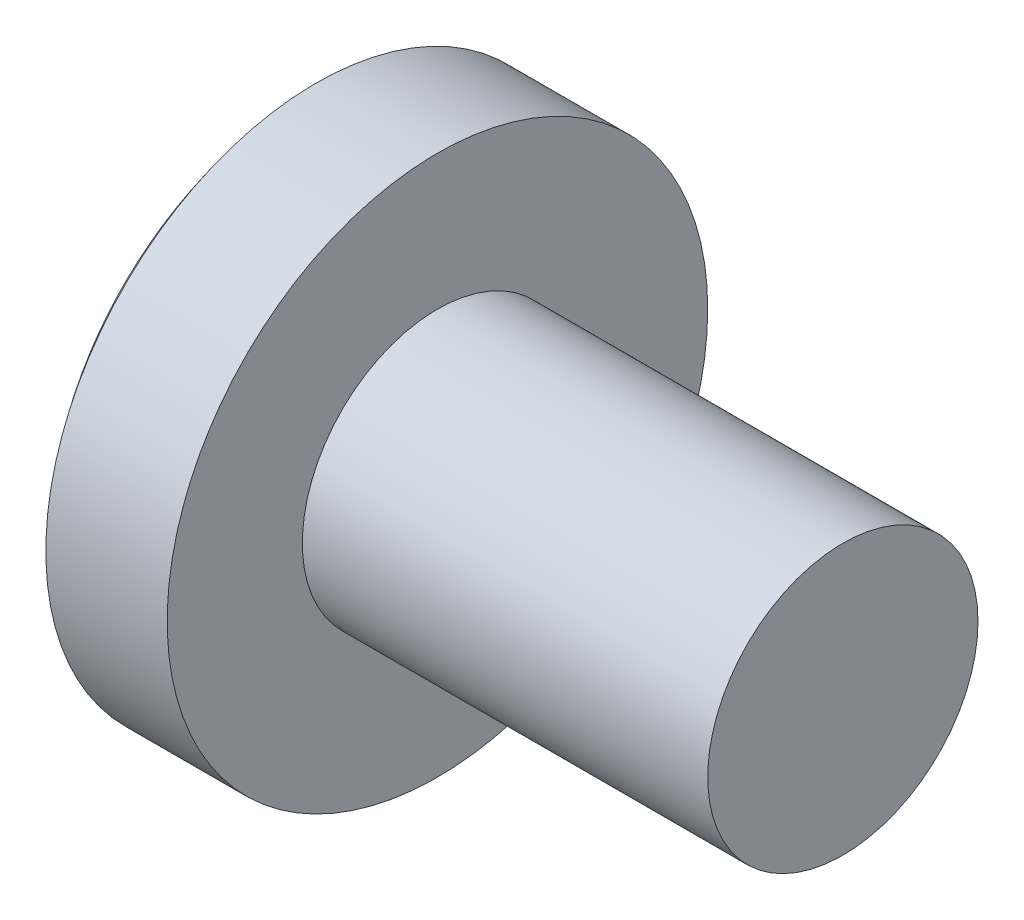
ISO-10303-21;
HEADER;
FILE_DESCRIPTION(('STEP AP214'),'2;1');
FILE_NAME('part.step','',(''),(''),'','','');
FILE_SCHEMA(('AUTOMOTIVE_DESIGN { 1 0 10303 214 1 1 1 1 }'));
ENDSEC;
DATA;
#1=APPLICATION_CONTEXT('core data for automotive mechanical design processes');
#2=APPLICATION_PROTOCOL_DEFINITION('international standard','automotive_design',2000,#1);
#3=PRODUCT_CONTEXT('',#1,'mechanical');
#4=PRODUCT('Part','Part','',(#3));
#5=PRODUCT_RELATED_PRODUCT_CATEGORY('part','',(#4));
#6=PRODUCT_DEFINITION_FORMATION('','',#4);
#7=PRODUCT_DEFINITION_CONTEXT('part definition',#1,'design');
#8=PRODUCT_DEFINITION('design','',#6,#7);
#9=PRODUCT_DEFINITION_SHAPE('','',#8);
#10=(LENGTH_UNIT() NAMED_UNIT(*) SI_UNIT(.MILLI.,.METRE.));
#11=(NAMED_UNIT(*) PLANE_ANGLE_UNIT() SI_UNIT($,.RADIAN.));
#12=(NAMED_UNIT(*) SI_UNIT($,.STERADIAN.) SOLID_ANGLE_UNIT());
#13=UNCERTAINTY_MEASURE_WITH_UNIT(LENGTH_MEASURE(1.E-05),#10,'distance_accuracy_value','');
#14=(GEOMETRIC_REPRESENTATION_CONTEXT(3) GLOBAL_UNCERTAINTY_ASSIGNED_CONTEXT((#13)) GLOBAL_UNIT_ASSIGNED_CONTEXT((#10,
#11,#12)) REPRESENTATION_CONTEXT('',''));
#15=CARTESIAN_POINT('',(0.,0.,0.));
#16=DIRECTION('',(0.,0.,1.));
#17=DIRECTION('',(1.,0.,0.));
#18=AXIS2_PLACEMENT_3D('',#15,#16,#17);
#19=CARTESIAN_POINT('',(3.2,0.,0.));
#20=DIRECTION('',(1.,0.,0.));
#21=DIRECTION('',(0.,1.,0.));
#22=AXIS2_PLACEMENT_3D('',#19,#20,#21);
#23=SPHERICAL_SURFACE('',#22,3.2);
#24=CARTESIAN_POINT('',(0.70200080064064,0.,0.));
#25=DIRECTION('',(1.,0.,0.));
#26=DIRECTION('',(0.,0.,-1.));
#27=AXIS2_PLACEMENT_3D('',#24,#25,#26);
#28=CIRCLE('',#27,2.);
#29=CARTESIAN_POINT('',(0.70200080064064,0.,-2.));
#30=VERTEX_POINT('',#29);
#31=EDGE_CURVE('E227',#30,#30,#28,.T.);
#32=ORIENTED_EDGE('',*,*,#31,.F.);
#33=EDGE_LOOP('',(#32));
#34=FACE_BOUND('',#33,.T.);
#35=CARTESIAN_POINT('',(3.2,-0.19,0.));
#36=DIRECTION('',(0.,1.,0.));
#37=DIRECTION('',(0.,0.,1.));
#38=AXIS2_PLACEMENT_3D('',#35,#36,#37);
#39=CIRCLE('',#38,3.19435439486604);
#40=CARTESIAN_POINT('',(0.128116518841081,-0.19,0.876031893359463));
#41=VERTEX_POINT('',#40);
#42=CARTESIAN_POINT('',(0.0434512517624563,-0.19,0.49));
#43=VERTEX_POINT('',#42);
#44=EDGE_CURVE('E161',#41,#43,#39,.F.);
#45=ORIENTED_EDGE('',*,*,#44,.T.);
#46=CARTESIAN_POINT('',(0.0434512517624563,-0.19,0.49));
#47=CARTESIAN_POINT('',(0.0408738773929441,-0.189985118490982,0.473411368352518));
#48=CARTESIAN_POINT('',(0.0385122737731478,-0.191375280547119,0.45678774580514));
#49=CARTESIAN_POINT('',(0.0342793774917008,-0.196894192604607,0.423939980878307));
#50=CARTESIAN_POINT('',(0.0324080180986077,-0.201022569613025,0.407715784402144));
#51=CARTESIAN_POINT('',(0.0292120609216635,-0.2119518671846,0.376115889679846));
#52=CARTESIAN_POINT('',(0.0278880075495777,-0.218755435732716,0.360741049401918));
#53=CARTESIAN_POINT('',(0.0258300216333501,-0.234850871954501,0.331318538531042));
#54=CARTESIAN_POINT('',(0.0250958387239777,-0.244141681706182,0.317270307107504));
#55=CARTESIAN_POINT('',(0.0242453397312418,-0.264820786877322,0.291079740811089));
#56=CARTESIAN_POINT('',(0.0241213644300016,-0.276181215319776,0.27891564613864));
#57=CARTESIAN_POINT('',(0.0244743849819796,-0.300751739444163,0.256633055026912));
#58=CARTESIAN_POINT('',(0.0249514532038772,-0.313962057691943,0.246514805087926));
#59=CARTESIAN_POINT('',(0.0264873092406797,-0.341764748147378,0.22866155902565));
#60=CARTESIAN_POINT('',(0.0275427361860059,-0.35634873623303,0.220913192921297));
#61=CARTESIAN_POINT('',(0.0302016331156969,-0.386546091629584,0.207923367225205));
#62=CARTESIAN_POINT('',(0.0318049788587366,-0.402159224933208,0.20268133996367));
#63=CARTESIAN_POINT('',(0.0350324297399574,-0.429857047162115,0.195839033890913));
#64=CARTESIAN_POINT('',(0.0365444859821157,-0.441812973684979,0.193648149789925));
#65=CARTESIAN_POINT('',(0.039817225939547,-0.465850838778572,0.190728248289838));
#66=CARTESIAN_POINT('',(0.0415775491224675,-0.47793257149748,0.189997133951023));
#67=CARTESIAN_POINT('',(0.0434512517624562,-0.49,0.19));
#68=B_SPLINE_CURVE_WITH_KNOTS('',3,(#46,#47,#48,#49,#50,#51,#52,#53,#54,#55,#56,#57,#58,#59,#60,
#61,#62,#63,#64,#65,#66,#67),.UNSPECIFIED.,.F.,.F.,(4,2,2,2,2,2,2,2,2,2,4),(0.,
0.0503064187517195,0.100605986293286,0.150955467701084,0.20128356741648,0.250978317771727,
0.300679052198083,0.350093989724498,0.39949772977393,0.43615717693199,0.472763925288841),.UNSPECIFIED.);
#69=CARTESIAN_POINT('',(0.0434512517624563,-0.49,0.19));
#70=VERTEX_POINT('',#69);
#71=EDGE_CURVE('E146',#43,#70,#68,.T.);
#72=ORIENTED_EDGE('',*,*,#71,.T.);
#73=CARTESIAN_POINT('',(3.2,0.,0.19));
#74=DIRECTION('',(0.,0.,-1.));
#75=DIRECTION('',(0.,1.,0.));
#76=AXIS2_PLACEMENT_3D('',#73,#74,#75);
#77=CIRCLE('',#76,3.19435439486604);
#78=CARTESIAN_POINT('',(0.128116518841081,-0.876031893359464,0.19));
#79=VERTEX_POINT('',#78);
#80=EDGE_CURVE('E170',#70,#79,#77,.F.);
#81=ORIENTED_EDGE('',*,*,#80,.T.);
#82=CARTESIAN_POINT('',(2.81136206679761,0.673140646055105,0.));
#83=DIRECTION('',(-0.500000000000001,0.866025403784438,0.));
#84=DIRECTION('',(-0.866025403784438,-0.500000000000001,0.));
#85=AXIS2_PLACEMENT_3D('',#82,#83,#84);
#86=CIRCLE('',#85,3.10416530286399);
#87=CARTESIAN_POINT('',(0.128116518841081,-0.876031893359464,-0.19));
#88=VERTEX_POINT('',#87);
#89=EDGE_CURVE('E173',#79,#88,#86,.F.);
#90=ORIENTED_EDGE('',*,*,#89,.T.);
#91=CARTESIAN_POINT('',(3.2,0.,-0.19));
#92=DIRECTION('',(0.,0.,1.));
#93=DIRECTION('',(1.,0.,0.));
#94=AXIS2_PLACEMENT_3D('',#91,#92,#93);
#95=CIRCLE('',#94,3.19435439486604);
#96=CARTESIAN_POINT('',(0.0434512517624563,-0.49,-0.19));
#97=VERTEX_POINT('',#96);
#98=EDGE_CURVE('E180',#88,#97,#95,.F.);
#99=ORIENTED_EDGE('',*,*,#98,.T.);
#100=CARTESIAN_POINT('',(0.0434512517624563,-0.49,-0.19));
#101=CARTESIAN_POINT('',(0.0408738773929441,-0.473411368352518,-0.189985118490982));
#102=CARTESIAN_POINT('',(0.0385122737731478,-0.45678774580514,-0.191375280547119));
#103=CARTESIAN_POINT('',(0.0342793774917008,-0.423939980878307,-0.196894192604607));
#104=CARTESIAN_POINT('',(0.0324080180986077,-0.407715784402144,-0.201022569613025));
#105=CARTESIAN_POINT('',(0.0292120609216635,-0.376115889679846,-0.2119518671846));
#106=CARTESIAN_POINT('',(0.0278880075495777,-0.360741049401919,-0.218755435732716));
#107=CARTESIAN_POINT('',(0.0258300216333501,-0.331318538531043,-0.234850871954501));
#108=CARTESIAN_POINT('',(0.0250958387239777,-0.317270307107504,-0.244141681706183));
#109=CARTESIAN_POINT('',(0.0242453397312419,-0.291079740811089,-0.264820786877322));
#110=CARTESIAN_POINT('',(0.0241213644300017,-0.278915646138641,-0.276181215319776));
#111=CARTESIAN_POINT('',(0.0244743849819797,-0.256633055026913,-0.300751739444163));
#112=CARTESIAN_POINT('',(0.0249514532038773,-0.246514805087927,-0.313962057691943));
#113=CARTESIAN_POINT('',(0.0264873092406797,-0.22866155902565,-0.341764748147378));
#114=CARTESIAN_POINT('',(0.0275427361860059,-0.220913192921297,-0.356348736233031));
#115=CARTESIAN_POINT('',(0.0302016331156969,-0.207923367225206,-0.386546091629584));
#116=CARTESIAN_POINT('',(0.0318049788587366,-0.20268133996367,-0.402159224933208));
#117=CARTESIAN_POINT('',(0.0350324297399575,-0.195839033890914,-0.429857047162115));
#118=CARTESIAN_POINT('',(0.0365444859821158,-0.193648149789925,-0.441812973684979));
#119=CARTESIAN_POINT('',(0.0398172259395471,-0.190728248289838,-0.465850838778572));
#120=CARTESIAN_POINT('',(0.0415775491224675,-0.189997133951024,-0.47793257149748));
#121=CARTESIAN_POINT('',(0.0434512517624562,-0.19,-0.49));
#122=B_SPLINE_CURVE_WITH_KNOTS('',3,(#100,#101,#102,#103,#104,#105,#106,#107,#108,#109,#110,
#111,#112,#113,#114,#115,#116,#117,#118,#119,#120,#121),.UNSPECIFIED.,.F.,.F.,(4,2,2,2,2,2,2,2,
2,2,4),(0.,0.0503064187517195,0.100605986293286,0.150955467701084,0.20128356741648,
0.250978317771727,0.300679052198083,0.350093989724498,0.39949772977393,0.43615717693199,
0.472763925288841),.UNSPECIFIED.);
#123=CARTESIAN_POINT('',(0.0434512517624563,-0.19,-0.49));
#124=VERTEX_POINT('',#123);
#125=EDGE_CURVE('E157',#97,#124,#122,.T.);
#126=ORIENTED_EDGE('',*,*,#125,.T.);
#127=CARTESIAN_POINT('',(3.2,-0.19,0.));
#128=DIRECTION('',(0.,1.,0.));
#129=DIRECTION('',(0.,0.,1.));
#130=AXIS2_PLACEMENT_3D('',#127,#128,#129);
#131=CIRCLE('',#130,3.19435439486604);
#132=CARTESIAN_POINT('',(0.128116518841082,-0.19,-0.876031893359464));
#133=VERTEX_POINT('',#132);
#134=EDGE_CURVE('E178',#124,#133,#131,.F.);
#135=ORIENTED_EDGE('',*,*,#134,.T.);
#136=CARTESIAN_POINT('',(2.81136206679761,0.,0.673140646055104));
#137=DIRECTION('',(-0.500000000000001,0.,0.866025403784438));
#138=DIRECTION('',(0.866025403784438,0.,0.500000000000001));
#139=AXIS2_PLACEMENT_3D('',#136,#137,#138);
#140=CIRCLE('',#139,3.10416530286399);
#141=CARTESIAN_POINT('',(0.128116518841082,0.19,-0.876031893359464));
#142=VERTEX_POINT('',#141);
#143=EDGE_CURVE('E181',#133,#142,#140,.F.);
#144=ORIENTED_EDGE('',*,*,#143,.T.);
#145=CARTESIAN_POINT('',(3.2,0.19,0.));
#146=DIRECTION('',(0.,-1.,0.));
#147=DIRECTION('',(0.,0.,-1.));
#148=AXIS2_PLACEMENT_3D('',#145,#146,#147);
#149=CIRCLE('',#148,3.19435439486604);
#150=CARTESIAN_POINT('',(0.0434512517624563,0.19,-0.49));
#151=VERTEX_POINT('',#150);
#152=EDGE_CURVE('E182',#142,#151,#149,.F.);
#153=ORIENTED_EDGE('',*,*,#152,.T.);
#154=CARTESIAN_POINT('',(0.0434512517624563,0.19,-0.49));
#155=CARTESIAN_POINT('',(0.0408738773929443,0.189985118490982,-0.473411368352519));
#156=CARTESIAN_POINT('',(0.0385122737731479,0.191375280547119,-0.45678774580514));
#157=CARTESIAN_POINT('',(0.0342793774917008,0.196894192604607,-0.423939980878307));
#158=CARTESIAN_POINT('',(0.0324080180986076,0.201022569613025,-0.407715784402144));
#159=CARTESIAN_POINT('',(0.0292120609216636,0.2119518671846,-0.376115889679846));
#160=CARTESIAN_POINT('',(0.027888007549578,0.218755435732716,-0.360741049401919));
#161=CARTESIAN_POINT('',(0.0258300216333505,0.234850871954501,-0.331318538531043));
#162=CARTESIAN_POINT('',(0.0250958387239778,0.244141681706182,-0.317270307107504));
#163=CARTESIAN_POINT('',(0.0242453397312417,0.264820786877322,-0.291079740811089));
#164=CARTESIAN_POINT('',(0.0241213644300013,0.276181215319776,-0.278915646138641));
#165=CARTESIAN_POINT('',(0.0244743849819796,0.300751739444164,-0.256633055026913));
#166=CARTESIAN_POINT('',(0.0249514532038776,0.313962057691943,-0.246514805087927));
#167=CARTESIAN_POINT('',(0.0264873092406803,0.341764748147378,-0.228661559025651));
#168=CARTESIAN_POINT('',(0.0275427361860064,0.356348736233031,-0.220913192921297));
#169=CARTESIAN_POINT('',(0.030201633115697,0.386546091629584,-0.207923367225206));
#170=CARTESIAN_POINT('',(0.0318049788587366,0.402159224933208,-0.20268133996367));
#171=CARTESIAN_POINT('',(0.0350324297399575,0.429857047162115,-0.195839033890914));
#172=CARTESIAN_POINT('',(0.036544485982116,0.441812973684979,-0.193648149789926));
#173=CARTESIAN_POINT('',(0.0398172259395474,0.465850838778572,-0.190728248289838));
#174=CARTESIAN_POINT('',(0.0415775491224679,0.47793257149748,-0.189997133951024));
#175=CARTESIAN_POINT('',(0.0434512517624562,0.49,-0.19));
#176=B_SPLINE_CURVE_WITH_KNOTS('',3,(#154,#155,#156,#157,#158,#159,#160,#161,#162,#163,#164,
#165,#166,#167,#168,#169,#170,#171,#172,#173,#174,#175),.UNSPECIFIED.,.F.,.F.,(4,2,2,2,2,2,2,2,
2,2,4),(0.,0.0503064187517196,0.100605986293286,0.150955467701084,0.20128356741648,
0.250978317771727,0.300679052198084,0.350093989724499,0.39949772977393,0.43615717693199,
0.472763925288841),.UNSPECIFIED.);
#177=CARTESIAN_POINT('',(0.0434512517624563,0.49,-0.19));
#178=VERTEX_POINT('',#177);
#179=EDGE_CURVE('E164',#151,#178,#176,.T.);
#180=ORIENTED_EDGE('',*,*,#179,.T.);
#181=CARTESIAN_POINT('',(3.2,0.,-0.19));
#182=DIRECTION('',(0.,0.,1.));
#183=DIRECTION('',(1.,0.,0.));
#184=AXIS2_PLACEMENT_3D('',#181,#182,#183);
#185=CIRCLE('',#184,3.19435439486604);
#186=CARTESIAN_POINT('',(0.128116518841081,0.876031893359463,-0.19));
#187=VERTEX_POINT('',#186);
#188=EDGE_CURVE('E185',#178,#187,#185,.F.);
#189=ORIENTED_EDGE('',*,*,#188,.T.);
#190=CARTESIAN_POINT('',(2.81136206679761,-0.673140646055105,0.));
#191=DIRECTION('',(-0.500000000000001,-0.866025403784438,0.));
#192=DIRECTION('',(0.866025403784438,-0.500000000000001,0.));
#193=AXIS2_PLACEMENT_3D('',#190,#191,#192);
#194=CIRCLE('',#193,3.10416530286399);
#195=CARTESIAN_POINT('',(0.128116518841082,0.876031893359463,0.19));
#196=VERTEX_POINT('',#195);
#197=EDGE_CURVE('E211',#187,#196,#194,.F.);
#198=ORIENTED_EDGE('',*,*,#197,.T.);
#199=CARTESIAN_POINT('',(3.2,0.,0.19));
#200=DIRECTION('',(0.,0.,-1.));
#201=DIRECTION('',(0.,1.,0.));
#202=AXIS2_PLACEMENT_3D('',#199,#200,#201);
#203=CIRCLE('',#202,3.19435439486604);
#204=CARTESIAN_POINT('',(0.0434512517624563,0.49,0.19));
#205=VERTEX_POINT('',#204);
#206=EDGE_CURVE('E214',#196,#205,#203,.F.);
#207=ORIENTED_EDGE('',*,*,#206,.T.);
#208=CARTESIAN_POINT('',(0.0434512517624563,0.49,0.19));
#209=CARTESIAN_POINT('',(0.0408738773929443,0.473411368352518,0.189985118490982));
#210=CARTESIAN_POINT('',(0.0385122737731479,0.45678774580514,0.191375280547119));
#211=CARTESIAN_POINT('',(0.0342793774917008,0.423939980878307,0.196894192604606));
#212=CARTESIAN_POINT('',(0.0324080180986076,0.407715784402144,0.201022569613024));
#213=CARTESIAN_POINT('',(0.0292120609216636,0.376115889679846,0.211951867184599));
#214=CARTESIAN_POINT('',(0.027888007549578,0.360741049401919,0.218755435732716));
#215=CARTESIAN_POINT('',(0.0258300216333504,0.331318538531043,0.234850871954501));
#216=CARTESIAN_POINT('',(0.0250958387239778,0.317270307107504,0.244141681706182));
#217=CARTESIAN_POINT('',(0.0242453397312416,0.291079740811089,0.264820786877322));
#218=CARTESIAN_POINT('',(0.0241213644300013,0.27891564613864,0.276181215319776));
#219=CARTESIAN_POINT('',(0.0244743849819795,0.256633055026913,0.300751739444163));
#220=CARTESIAN_POINT('',(0.0249514532038775,0.246514805087927,0.313962057691943));
#221=CARTESIAN_POINT('',(0.0264873092406802,0.22866155902565,0.341764748147378));
#222=CARTESIAN_POINT('',(0.0275427361860063,0.220913192921297,0.35634873623303));
#223=CARTESIAN_POINT('',(0.030201633115697,0.207923367225206,0.386546091629584));
#224=CARTESIAN_POINT('',(0.0318049788587365,0.20268133996367,0.402159224933208));
#225=CARTESIAN_POINT('',(0.0350324297399575,0.195839033890914,0.429857047162115));
#226=CARTESIAN_POINT('',(0.0365444859821159,0.193648149789925,0.441812973684979));
#227=CARTESIAN_POINT('',(0.0398172259395474,0.190728248289838,0.465850838778572));
#228=CARTESIAN_POINT('',(0.0415775491224678,0.189997133951024,0.47793257149748));
#229=CARTESIAN_POINT('',(0.0434512517624561,0.19,0.49));
#230=B_SPLINE_CURVE_WITH_KNOTS('',3,(#208,#209,#210,#211,#212,#213,#214,#215,#216,#217,#218,
#219,#220,#221,#222,#223,#224,#225,#226,#227,#228,#229),.UNSPECIFIED.,.F.,.F.,(4,2,2,2,2,2,2,2,
2,2,4),(0.,0.0503064187517196,0.100605986293286,0.150955467701084,0.20128356741648,
0.250978317771727,0.300679052198084,0.350093989724499,0.39949772977393,0.43615717693199,
0.472763925288841),.UNSPECIFIED.);
#231=CARTESIAN_POINT('',(0.0434512517624563,0.19,0.49));
#232=VERTEX_POINT('',#231);
#233=EDGE_CURVE('E284',#205,#232,#230,.T.);
#234=ORIENTED_EDGE('',*,*,#233,.T.);
#235=CARTESIAN_POINT('',(3.2,0.19,0.));
#236=DIRECTION('',(0.,-1.,0.));
#237=DIRECTION('',(0.,0.,-1.));
#238=AXIS2_PLACEMENT_3D('',#235,#236,#237);
#239=CIRCLE('',#238,3.19435439486604);
#240=CARTESIAN_POINT('',(0.128116518841081,0.19,0.876031893359463));
#241=VERTEX_POINT('',#240);
#242=EDGE_CURVE('E165',#232,#241,#239,.F.);
#243=ORIENTED_EDGE('',*,*,#242,.T.);
#244=CARTESIAN_POINT('',(2.81136206679761,0.,-0.673140646055105));
#245=DIRECTION('',(-0.500000000000001,0.,-0.866025403784438));
#246=DIRECTION('',(-0.866025403784438,0.,0.500000000000001));
#247=AXIS2_PLACEMENT_3D('',#244,#245,#246);
#248=CIRCLE('',#247,3.10416530286399);
#249=EDGE_CURVE('E169',#241,#41,#248,.F.);
#250=ORIENTED_EDGE('',*,*,#249,.T.);
#251=EDGE_LOOP('',(#45,#72,#81,#90,#99,#126,#135,#144,#153,#180,#189,#198,#207,#234,#243,#250));
#252=FACE_BOUND('',#251,.T.);
#253=ADVANCED_FACE('F36',(#34,#252),#23,.T.);
#254=CARTESIAN_POINT('',(4.6,1.,0.));
#255=DIRECTION('',(1.,0.,0.));
#256=DIRECTION('',(0.,0.,-1.));
#257=AXIS2_PLACEMENT_3D('',#254,#255,#256);
#258=PLANE('',#257);
#259=CARTESIAN_POINT('',(4.6,0.,0.));
#260=DIRECTION('',(1.,0.,0.));
#261=DIRECTION('',(0.,0.,-1.));
#262=AXIS2_PLACEMENT_3D('',#259,#260,#261);
#263=CIRCLE('',#262,1.);
#264=CARTESIAN_POINT('',(4.6,0.,-1.));
#265=VERTEX_POINT('',#264);
#266=EDGE_CURVE('E266',#265,#265,#263,.T.);
#267=ORIENTED_EDGE('',*,*,#266,.T.);
#268=EDGE_LOOP('',(#267));
#269=FACE_BOUND('',#268,.T.);
#270=ADVANCED_FACE('F322',(#269),#258,.T.);
#271=CARTESIAN_POINT('',(4.51581291088132,0.,0.));
#272=DIRECTION('',(1.,0.,0.));
#273=DIRECTION('',(0.,0.,-1.));
#274=AXIS2_PLACEMENT_3D('',#271,#272,#273);
#275=CYLINDRICAL_SURFACE('',#274,1.);
#276=CARTESIAN_POINT('',(1.6,0.,0.));
#277=DIRECTION('',(1.,0.,0.));
#278=DIRECTION('',(0.,0.,-1.));
#279=AXIS2_PLACEMENT_3D('',#276,#277,#278);
#280=CIRCLE('',#279,1.);
#281=CARTESIAN_POINT('',(1.6,0.,-1.));
#282=VERTEX_POINT('',#281);
#283=EDGE_CURVE('E268',#282,#282,#280,.T.);
#284=ORIENTED_EDGE('',*,*,#283,.T.);
#285=EDGE_LOOP('',(#284));
#286=FACE_BOUND('',#285,.T.);
#287=ORIENTED_EDGE('',*,*,#266,.F.);
#288=EDGE_LOOP('',(#287));
#289=FACE_BOUND('',#288,.T.);
#290=ADVANCED_FACE('F327',(#286,#289),#275,.T.);
#291=CARTESIAN_POINT('',(1.6,1.3,0.));
#292=DIRECTION('',(1.,0.,0.));
#293=DIRECTION('',(0.,0.,-1.));
#294=AXIS2_PLACEMENT_3D('',#291,#292,#293);
#295=PLANE('',#294);
#296=CARTESIAN_POINT('',(1.6,0.,0.));
#297=DIRECTION('',(1.,0.,0.));
#298=DIRECTION('',(0.,0.,-1.));
#299=AXIS2_PLACEMENT_3D('',#296,#297,#298);
#300=CIRCLE('',#299,2.);
#301=CARTESIAN_POINT('',(1.6,0.,-2.));
#302=VERTEX_POINT('',#301);
#303=EDGE_CURVE('E273',#302,#302,#300,.T.);
#304=ORIENTED_EDGE('',*,*,#303,.T.);
#305=EDGE_LOOP('',(#304));
#306=FACE_BOUND('',#305,.T.);
#307=ORIENTED_EDGE('',*,*,#283,.F.);
#308=EDGE_LOOP('',(#307));
#309=FACE_BOUND('',#308,.T.);
#310=ADVANCED_FACE('F338',(#306,#309),#295,.T.);
#311=CARTESIAN_POINT('',(4.51581291088132,0.,0.));
#312=DIRECTION('',(1.,0.,0.));
#313=DIRECTION('',(0.,0.,-1.));
#314=AXIS2_PLACEMENT_3D('',#311,#312,#313);
#315=CYLINDRICAL_SURFACE('',#314,2.);
#316=ORIENTED_EDGE('',*,*,#31,.T.);
#317=EDGE_LOOP('',(#316));
#318=FACE_BOUND('',#317,.T.);
#319=ORIENTED_EDGE('',*,*,#303,.F.);
#320=EDGE_LOOP('',(#319));
#321=FACE_BOUND('',#320,.T.);
#322=ADVANCED_FACE('F318',(#318,#321),#315,.T.);
#323=CARTESIAN_POINT('',(1.12,0.19,0.19));
#324=DIRECTION('',(0.,-1.,0.));
#325=DIRECTION('',(0.,0.,-1.));
#326=AXIS2_PLACEMENT_3D('',#323,#324,#325);
#327=PLANE('',#326);
#328=ORIENTED_EDGE('',*,*,#242,.F.);
#329=DIRECTION('',(-1.,0.,0.));
#330=VECTOR('',#329,1.);
#331=CARTESIAN_POINT('',(1.12,0.19,0.49));
#332=LINE('',#331,#330);
#333=CARTESIAN_POINT('',(0.796743371481682,0.19,0.49));
#334=VERTEX_POINT('',#333);
#335=EDGE_CURVE('E373',#232,#334,#332,.F.);
#336=ORIENTED_EDGE('',*,*,#335,.T.);
#337=DIRECTION('',(-0.866025403784438,0.,0.500000000000001));
#338=VECTOR('',#337,1.);
#339=CARTESIAN_POINT('',(0.,0.19,0.95));
#340=LINE('',#339,#338);
#341=EDGE_CURVE('E225',#334,#241,#340,.T.);
#342=ORIENTED_EDGE('',*,*,#341,.T.);
#343=EDGE_LOOP('',(#328,#336,#342));
#344=FACE_BOUND('',#343,.T.);
#345=ADVANCED_FACE('F311',(#344),#327,.T.);
#346=CARTESIAN_POINT('',(0.,0.,0.95));
#347=DIRECTION('',(-0.500000000000001,0.,-0.866025403784438));
#348=DIRECTION('',(-0.866025403784438,0.,0.500000000000001));
#349=AXIS2_PLACEMENT_3D('',#346,#347,#348);
#350=PLANE('',#349);
#351=ORIENTED_EDGE('',*,*,#341,.F.);
#352=CARTESIAN_POINT('',(0.796743371481682,0.49,0.49));
#353=DIRECTION('',(-0.500000000000001,0.,-0.866025403784438));
#354=DIRECTION('',(-0.866025403784438,0.,0.500000000000001));
#355=AXIS2_PLACEMENT_3D('',#352,#353,#354);
#356=ELLIPSE('',#355,0.599999999999999,0.3);
#357=CARTESIAN_POINT('',(1.12,0.255120490379309,0.303367698507617));
#358=VERTEX_POINT('',#357);
#359=EDGE_CURVE('E232',#334,#358,#356,.F.);
#360=ORIENTED_EDGE('',*,*,#359,.T.);
#361=DIRECTION('',(0.,-1.,0.));
#362=VECTOR('',#361,1.);
#363=CARTESIAN_POINT('',(1.12,0.,0.303367698507617));
#364=LINE('',#363,#362);
#365=CARTESIAN_POINT('',(1.12,-0.255120490379309,0.303367698507617));
#366=VERTEX_POINT('',#365);
#367=EDGE_CURVE('E198',#358,#366,#364,.T.);
#368=ORIENTED_EDGE('',*,*,#367,.T.);
#369=CARTESIAN_POINT('',(0.796743371481682,-0.49,0.49));
#370=DIRECTION('',(-0.500000000000001,0.,-0.866025403784438));
#371=DIRECTION('',(-0.866025403784438,0.,0.500000000000001));
#372=AXIS2_PLACEMENT_3D('',#369,#370,#371);
#373=ELLIPSE('',#372,0.599999999999999,0.3);
#374=CARTESIAN_POINT('',(0.796743371481682,-0.19,0.49));
#375=VERTEX_POINT('',#374);
#376=EDGE_CURVE('E224',#375,#366,#373,.T.);
#377=ORIENTED_EDGE('',*,*,#376,.F.);
#378=DIRECTION('',(-0.866025403784438,0.,0.500000000000001));
#379=VECTOR('',#378,1.);
#380=CARTESIAN_POINT('',(1.16908965343809,-0.19,0.275025773880713));
#381=LINE('',#380,#379);
#382=EDGE_CURVE('E163',#375,#41,#381,.T.);
#383=ORIENTED_EDGE('',*,*,#382,.T.);
#384=ORIENTED_EDGE('',*,*,#249,.F.);
#385=EDGE_LOOP('',(#351,#360,#368,#377,#383,#384));
#386=FACE_BOUND('',#385,.T.);
#387=ADVANCED_FACE('F309',(#386),#350,.T.);
#388=CARTESIAN_POINT('',(1.12,-0.19,0.19));
#389=DIRECTION('',(0.,1.,0.));
#390=DIRECTION('',(0.,0.,1.));
#391=AXIS2_PLACEMENT_3D('',#388,#389,#390);
#392=PLANE('',#391);
#393=ORIENTED_EDGE('',*,*,#382,.F.);
#394=DIRECTION('',(-1.,0.,0.));
#395=VECTOR('',#394,1.);
#396=CARTESIAN_POINT('',(1.12,-0.19,0.49));
#397=LINE('',#396,#395);
#398=EDGE_CURVE('E150',#375,#43,#397,.T.);
#399=ORIENTED_EDGE('',*,*,#398,.T.);
#400=ORIENTED_EDGE('',*,*,#44,.F.);
#401=EDGE_LOOP('',(#393,#399,#400));
#402=FACE_BOUND('',#401,.T.);
#403=ADVANCED_FACE('F160',(#402),#392,.T.);
#404=CARTESIAN_POINT('',(1.12,-0.19,0.19));
#405=DIRECTION('',(0.,0.,-1.));
#406=DIRECTION('',(0.,1.,0.));
#407=AXIS2_PLACEMENT_3D('',#404,#405,#406);
#408=PLANE('',#407);
#409=ORIENTED_EDGE('',*,*,#80,.F.);
#410=DIRECTION('',(-1.,0.,0.));
#411=VECTOR('',#410,1.);
#412=CARTESIAN_POINT('',(1.12,-0.49,0.19));
#413=LINE('',#412,#411);
#414=CARTESIAN_POINT('',(0.796743371481681,-0.49,0.19));
#415=VERTEX_POINT('',#414);
#416=EDGE_CURVE('E153',#70,#415,#413,.F.);
#417=ORIENTED_EDGE('',*,*,#416,.T.);
#418=DIRECTION('',(-0.866025403784438,-0.500000000000001,0.));
#419=VECTOR('',#418,1.);
#420=CARTESIAN_POINT('',(0.,-0.95,0.19));
#421=LINE('',#420,#419);
#422=EDGE_CURVE('E186',#415,#79,#421,.T.);
#423=ORIENTED_EDGE('',*,*,#422,.T.);
#424=EDGE_LOOP('',(#409,#417,#423));
#425=FACE_BOUND('',#424,.T.);
#426=ADVANCED_FACE('F304',(#425),#408,.T.);
#427=CARTESIAN_POINT('',(0.,-0.95,0.));
#428=DIRECTION('',(-0.500000000000001,0.866025403784438,0.));
#429=DIRECTION('',(-0.866025403784438,-0.500000000000001,0.));
#430=AXIS2_PLACEMENT_3D('',#427,#428,#429);
#431=PLANE('',#430);
#432=ORIENTED_EDGE('',*,*,#422,.F.);
#433=CARTESIAN_POINT('',(0.796743371481681,-0.49,0.49));
#434=DIRECTION('',(-0.500000000000001,0.866025403784438,0.));
#435=DIRECTION('',(-0.866025403784438,-0.500000000000001,0.));
#436=AXIS2_PLACEMENT_3D('',#433,#434,#435);
#437=ELLIPSE('',#436,0.599999999999999,0.3);
#438=CARTESIAN_POINT('',(1.12,-0.303367698507617,0.255120490379309));
#439=VERTEX_POINT('',#438);
#440=EDGE_CURVE('E201',#415,#439,#437,.F.);
#441=ORIENTED_EDGE('',*,*,#440,.T.);
#442=DIRECTION('',(0.,0.,-1.));
#443=VECTOR('',#442,1.);
#444=CARTESIAN_POINT('',(1.12,-0.303367698507617,0.));
#445=LINE('',#444,#443);
#446=CARTESIAN_POINT('',(1.12,-0.303367698507617,-0.255120490379309));
#447=VERTEX_POINT('',#446);
#448=EDGE_CURVE('E195',#439,#447,#445,.T.);
#449=ORIENTED_EDGE('',*,*,#448,.T.);
#450=CARTESIAN_POINT('',(0.796743371481681,-0.49,-0.49));
#451=DIRECTION('',(-0.500000000000001,0.866025403784438,0.));
#452=DIRECTION('',(-0.866025403784438,-0.500000000000001,0.));
#453=AXIS2_PLACEMENT_3D('',#450,#451,#452);
#454=ELLIPSE('',#453,0.599999999999999,0.3);
#455=CARTESIAN_POINT('',(0.796743371481681,-0.49,-0.19));
#456=VERTEX_POINT('',#455);
#457=EDGE_CURVE('E199',#456,#447,#454,.T.);
#458=ORIENTED_EDGE('',*,*,#457,.F.);
#459=DIRECTION('',(-0.866025403784438,-0.500000000000001,0.));
#460=VECTOR('',#459,1.);
#461=CARTESIAN_POINT('',(1.16908965343809,-0.275025773880713,-0.19));
#462=LINE('',#461,#460);
#463=EDGE_CURVE('E189',#456,#88,#462,.T.);
#464=ORIENTED_EDGE('',*,*,#463,.T.);
#465=ORIENTED_EDGE('',*,*,#89,.F.);
#466=EDGE_LOOP('',(#432,#441,#449,#458,#464,#465));
#467=FACE_BOUND('',#466,.T.);
#468=ADVANCED_FACE('F300',(#467),#431,.T.);
#469=CARTESIAN_POINT('',(1.12,-0.19,-0.19));
#470=DIRECTION('',(0.,0.,1.));
#471=DIRECTION('',(1.,0.,0.));
#472=AXIS2_PLACEMENT_3D('',#469,#470,#471);
#473=PLANE('',#472);
#474=ORIENTED_EDGE('',*,*,#463,.F.);
#475=DIRECTION('',(-1.,0.,0.));
#476=VECTOR('',#475,1.);
#477=CARTESIAN_POINT('',(1.12,-0.49,-0.19));
#478=LINE('',#477,#476);
#479=EDGE_CURVE('E364',#456,#97,#478,.T.);
#480=ORIENTED_EDGE('',*,*,#479,.T.);
#481=ORIENTED_EDGE('',*,*,#98,.F.);
#482=EDGE_LOOP('',(#474,#480,#481));
#483=FACE_BOUND('',#482,.T.);
#484=ADVANCED_FACE('F303',(#483),#473,.T.);
#485=CARTESIAN_POINT('',(1.12,-0.19,-0.19));
#486=DIRECTION('',(0.,1.,0.));
#487=DIRECTION('',(0.,0.,1.));
#488=AXIS2_PLACEMENT_3D('',#485,#486,#487);
#489=PLANE('',#488);
#490=ORIENTED_EDGE('',*,*,#134,.F.);
#491=DIRECTION('',(-1.,0.,0.));
#492=VECTOR('',#491,1.);
#493=CARTESIAN_POINT('',(1.12,-0.19,-0.49));
#494=LINE('',#493,#492);
#495=CARTESIAN_POINT('',(0.796743371481682,-0.19,-0.49));
#496=VERTEX_POINT('',#495);
#497=EDGE_CURVE('E367',#124,#496,#494,.F.);
#498=ORIENTED_EDGE('',*,*,#497,.T.);
#499=DIRECTION('',(-0.866025403784438,0.,-0.500000000000001));
#500=VECTOR('',#499,1.);
#501=CARTESIAN_POINT('',(0.,-0.19,-0.95));
#502=LINE('',#501,#500);
#503=EDGE_CURVE('E194',#496,#133,#502,.T.);
#504=ORIENTED_EDGE('',*,*,#503,.T.);
#505=EDGE_LOOP('',(#490,#498,#504));
#506=FACE_BOUND('',#505,.T.);
#507=ADVANCED_FACE('F308',(#506),#489,.T.);
#508=CARTESIAN_POINT('',(0.,0.,-0.95));
#509=DIRECTION('',(-0.500000000000001,0.,0.866025403784438));
#510=DIRECTION('',(0.866025403784438,0.,0.500000000000001));
#511=AXIS2_PLACEMENT_3D('',#508,#509,#510);
#512=PLANE('',#511);
#513=ORIENTED_EDGE('',*,*,#503,.F.);
#514=CARTESIAN_POINT('',(0.796743371481682,-0.49,-0.49));
#515=DIRECTION('',(-0.500000000000001,0.,0.866025403784438));
#516=DIRECTION('',(-0.866025403784438,0.,-0.500000000000001));
#517=AXIS2_PLACEMENT_3D('',#514,#515,#516);
#518=ELLIPSE('',#517,0.599999999999999,0.3);
#519=CARTESIAN_POINT('',(1.12,-0.255120490379309,-0.303367698507618));
#520=VERTEX_POINT('',#519);
#521=EDGE_CURVE('E11',#496,#520,#518,.F.);
#522=ORIENTED_EDGE('',*,*,#521,.T.);
#523=DIRECTION('',(0.,1.,0.));
#524=VECTOR('',#523,1.);
#525=CARTESIAN_POINT('',(1.12,0.,-0.303367698507618));
#526=LINE('',#525,#524);
#527=CARTESIAN_POINT('',(1.12,0.255120490379309,-0.303367698507618));
#528=VERTEX_POINT('',#527);
#529=EDGE_CURVE('E197',#520,#528,#526,.T.);
#530=ORIENTED_EDGE('',*,*,#529,.T.);
#531=CARTESIAN_POINT('',(0.796743371481682,0.49,-0.49));
#532=DIRECTION('',(-0.500000000000001,0.,0.866025403784438));
#533=DIRECTION('',(-0.866025403784438,0.,-0.500000000000001));
#534=AXIS2_PLACEMENT_3D('',#531,#532,#533);
#535=ELLIPSE('',#534,0.599999999999999,0.3);
#536=CARTESIAN_POINT('',(0.796743371481682,0.19,-0.49));
#537=VERTEX_POINT('',#536);
#538=EDGE_CURVE('E45',#537,#528,#535,.T.);
#539=ORIENTED_EDGE('',*,*,#538,.F.);
#540=DIRECTION('',(-0.866025403784438,0.,-0.500000000000001));
#541=VECTOR('',#540,1.);
#542=CARTESIAN_POINT('',(1.16908965343809,0.19,-0.275025773880713));
#543=LINE('',#542,#541);
#544=EDGE_CURVE('E209',#537,#142,#543,.T.);
#545=ORIENTED_EDGE('',*,*,#544,.T.);
#546=ORIENTED_EDGE('',*,*,#143,.F.);
#547=EDGE_LOOP('',(#513,#522,#530,#539,#545,#546));
#548=FACE_BOUND('',#547,.T.);
#549=ADVANCED_FACE('F252',(#548),#512,.T.);
#550=CARTESIAN_POINT('',(1.12,0.19,-0.19));
#551=DIRECTION('',(0.,-1.,0.));
#552=DIRECTION('',(0.,0.,-1.));
#553=AXIS2_PLACEMENT_3D('',#550,#551,#552);
#554=PLANE('',#553);
#555=ORIENTED_EDGE('',*,*,#544,.F.);
#556=DIRECTION('',(-1.,0.,0.));
#557=VECTOR('',#556,1.);
#558=CARTESIAN_POINT('',(1.12,0.19,-0.49));
#559=LINE('',#558,#557);
#560=EDGE_CURVE('E248',#537,#151,#559,.T.);
#561=ORIENTED_EDGE('',*,*,#560,.T.);
#562=ORIENTED_EDGE('',*,*,#152,.F.);
#563=EDGE_LOOP('',(#555,#561,#562));
#564=FACE_BOUND('',#563,.T.);
#565=ADVANCED_FACE('F307',(#564),#554,.T.);
#566=CARTESIAN_POINT('',(1.12,0.19,-0.19));
#567=DIRECTION('',(0.,0.,1.));
#568=DIRECTION('',(1.,0.,0.));
#569=AXIS2_PLACEMENT_3D('',#566,#567,#568);
#570=PLANE('',#569);
#571=ORIENTED_EDGE('',*,*,#188,.F.);
#572=DIRECTION('',(-1.,0.,0.));
#573=VECTOR('',#572,1.);
#574=CARTESIAN_POINT('',(1.12,0.49,-0.19));
#575=LINE('',#574,#573);
#576=CARTESIAN_POINT('',(0.796743371481682,0.49,-0.19));
#577=VERTEX_POINT('',#576);
#578=EDGE_CURVE('E377',#178,#577,#575,.F.);
#579=ORIENTED_EDGE('',*,*,#578,.T.);
#580=DIRECTION('',(-0.866025403784438,0.500000000000001,0.));
#581=VECTOR('',#580,1.);
#582=CARTESIAN_POINT('',(0.,0.95,-0.19));
#583=LINE('',#582,#581);
#584=EDGE_CURVE('E206',#577,#187,#583,.T.);
#585=ORIENTED_EDGE('',*,*,#584,.T.);
#586=EDGE_LOOP('',(#571,#579,#585));
#587=FACE_BOUND('',#586,.T.);
#588=ADVANCED_FACE('F397',(#587),#570,.T.);
#589=CARTESIAN_POINT('',(0.,0.95,0.));
#590=DIRECTION('',(-0.500000000000001,-0.866025403784438,0.));
#591=DIRECTION('',(0.866025403784438,-0.500000000000001,0.));
#592=AXIS2_PLACEMENT_3D('',#589,#590,#591);
#593=PLANE('',#592);
#594=ORIENTED_EDGE('',*,*,#584,.F.);
#595=CARTESIAN_POINT('',(0.796743371481681,0.49,-0.49));
#596=DIRECTION('',(-0.500000000000001,-0.866025403784438,0.));
#597=DIRECTION('',(-0.866025403784438,0.500000000000001,0.));
#598=AXIS2_PLACEMENT_3D('',#595,#596,#597);
#599=ELLIPSE('',#598,0.599999999999999,0.3);
#600=CARTESIAN_POINT('',(1.12,0.303367698507617,-0.255120490379309));
#601=VERTEX_POINT('',#600);
#602=EDGE_CURVE('E221',#577,#601,#599,.F.);
#603=ORIENTED_EDGE('',*,*,#602,.T.);
#604=DIRECTION('',(0.,0.,1.));
#605=VECTOR('',#604,1.);
#606=CARTESIAN_POINT('',(1.12,0.303367698507617,0.));
#607=LINE('',#606,#605);
#608=CARTESIAN_POINT('',(1.12,0.303367698507617,0.255120490379309));
#609=VERTEX_POINT('',#608);
#610=EDGE_CURVE('E217',#601,#609,#607,.T.);
#611=ORIENTED_EDGE('',*,*,#610,.T.);
#612=CARTESIAN_POINT('',(0.796743371481681,0.49,0.49));
#613=DIRECTION('',(-0.500000000000001,-0.866025403784438,0.));
#614=DIRECTION('',(-0.866025403784438,0.500000000000001,0.));
#615=AXIS2_PLACEMENT_3D('',#612,#613,#614);
#616=ELLIPSE('',#615,0.599999999999999,0.3);
#617=CARTESIAN_POINT('',(0.796743371481681,0.49,0.19));
#618=VERTEX_POINT('',#617);
#619=EDGE_CURVE('E205',#618,#609,#616,.T.);
#620=ORIENTED_EDGE('',*,*,#619,.F.);
#621=DIRECTION('',(-0.866025403784438,0.500000000000001,0.));
#622=VECTOR('',#621,1.);
#623=CARTESIAN_POINT('',(1.16908965343809,0.275025773880713,0.19));
#624=LINE('',#623,#622);
#625=EDGE_CURVE('E210',#618,#196,#624,.T.);
#626=ORIENTED_EDGE('',*,*,#625,.T.);
#627=ORIENTED_EDGE('',*,*,#197,.F.);
#628=EDGE_LOOP('',(#594,#603,#611,#620,#626,#627));
#629=FACE_BOUND('',#628,.T.);
#630=ADVANCED_FACE('F38',(#629),#593,.T.);
#631=CARTESIAN_POINT('',(1.12,0.19,0.19));
#632=DIRECTION('',(0.,0.,-1.));
#633=DIRECTION('',(0.,1.,0.));
#634=AXIS2_PLACEMENT_3D('',#631,#632,#633);
#635=PLANE('',#634);
#636=ORIENTED_EDGE('',*,*,#625,.F.);
#637=DIRECTION('',(-1.,0.,0.));
#638=VECTOR('',#637,1.);
#639=CARTESIAN_POINT('',(1.12,0.49,0.19));
#640=LINE('',#639,#638);
#641=EDGE_CURVE('E370',#618,#205,#640,.T.);
#642=ORIENTED_EDGE('',*,*,#641,.T.);
#643=ORIENTED_EDGE('',*,*,#206,.F.);
#644=EDGE_LOOP('',(#636,#642,#643));
#645=FACE_BOUND('',#644,.T.);
#646=ADVANCED_FACE('F421',(#645),#635,.T.);
#647=CARTESIAN_POINT('',(1.12,0.19,0.19));
#648=DIRECTION('',(1.,0.,0.));
#649=DIRECTION('',(0.,0.,-1.));
#650=AXIS2_PLACEMENT_3D('',#647,#648,#649);
#651=PLANE('',#650);
#652=ORIENTED_EDGE('',*,*,#367,.F.);
#653=CARTESIAN_POINT('',(1.12,0.49,0.49));
#654=DIRECTION('',(1.,0.,0.));
#655=DIRECTION('',(0.,0.,-1.));
#656=AXIS2_PLACEMENT_3D('',#653,#654,#655);
#657=CIRCLE('',#656,0.3);
#658=EDGE_CURVE('E258',#358,#609,#657,.T.);
#659=ORIENTED_EDGE('',*,*,#658,.T.);
#660=ORIENTED_EDGE('',*,*,#610,.F.);
#661=CARTESIAN_POINT('',(1.12,0.49,-0.49));
#662=DIRECTION('',(1.,0.,0.));
#663=DIRECTION('',(0.,0.,-1.));
#664=AXIS2_PLACEMENT_3D('',#661,#662,#663);
#665=CIRCLE('',#664,0.3);
#666=EDGE_CURVE('E202',#601,#528,#665,.T.);
#667=ORIENTED_EDGE('',*,*,#666,.T.);
#668=ORIENTED_EDGE('',*,*,#529,.F.);
#669=CARTESIAN_POINT('',(1.12,-0.49,-0.49));
#670=DIRECTION('',(1.,0.,0.));
#671=DIRECTION('',(0.,0.,-1.));
#672=AXIS2_PLACEMENT_3D('',#669,#670,#671);
#673=CIRCLE('',#672,0.3);
#674=EDGE_CURVE('E53',#520,#447,#673,.T.);
#675=ORIENTED_EDGE('',*,*,#674,.T.);
#676=ORIENTED_EDGE('',*,*,#448,.F.);
#677=CARTESIAN_POINT('',(1.12,-0.49,0.49));
#678=DIRECTION('',(1.,0.,0.));
#679=DIRECTION('',(0.,0.,-1.));
#680=AXIS2_PLACEMENT_3D('',#677,#678,#679);
#681=CIRCLE('',#680,0.3);
#682=EDGE_CURVE('E380',#439,#366,#681,.T.);
#683=ORIENTED_EDGE('',*,*,#682,.T.);
#684=EDGE_LOOP('',(#652,#659,#660,#667,#668,#675,#676,#683));
#685=FACE_BOUND('',#684,.T.);
#686=ADVANCED_FACE('F256',(#685),#651,.F.);
#687=CARTESIAN_POINT('',(1.12,-0.49,0.49));
#688=DIRECTION('',(-1.,0.,0.));
#689=DIRECTION('',(0.,0.,1.));
#690=AXIS2_PLACEMENT_3D('',#687,#688,#689);
#691=CYLINDRICAL_SURFACE('',#690,0.3);
#692=ORIENTED_EDGE('',*,*,#682,.F.);
#693=ORIENTED_EDGE('',*,*,#440,.F.);
#694=ORIENTED_EDGE('',*,*,#416,.F.);
#695=ORIENTED_EDGE('',*,*,#71,.F.);
#696=ORIENTED_EDGE('',*,*,#398,.F.);
#697=ORIENTED_EDGE('',*,*,#376,.T.);
#698=EDGE_LOOP('',(#692,#693,#694,#695,#696,#697));
#699=FACE_BOUND('',#698,.T.);
#700=ADVANCED_FACE('F148',(#699),#691,.T.);
#701=CARTESIAN_POINT('',(1.12,-0.49,-0.49));
#702=DIRECTION('',(-1.,0.,0.));
#703=DIRECTION('',(0.,0.,1.));
#704=AXIS2_PLACEMENT_3D('',#701,#702,#703);
#705=CYLINDRICAL_SURFACE('',#704,0.3);
#706=ORIENTED_EDGE('',*,*,#674,.F.);
#707=ORIENTED_EDGE('',*,*,#521,.F.);
#708=ORIENTED_EDGE('',*,*,#497,.F.);
#709=ORIENTED_EDGE('',*,*,#125,.F.);
#710=ORIENTED_EDGE('',*,*,#479,.F.);
#711=ORIENTED_EDGE('',*,*,#457,.T.);
#712=EDGE_LOOP('',(#706,#707,#708,#709,#710,#711));
#713=FACE_BOUND('',#712,.T.);
#714=ADVANCED_FACE('F352',(#713),#705,.T.);
#715=CARTESIAN_POINT('',(1.12,0.49,0.49));
#716=DIRECTION('',(-1.,0.,0.));
#717=DIRECTION('',(0.,0.,1.));
#718=AXIS2_PLACEMENT_3D('',#715,#716,#717);
#719=CYLINDRICAL_SURFACE('',#718,0.3);
#720=ORIENTED_EDGE('',*,*,#658,.F.);
#721=ORIENTED_EDGE('',*,*,#359,.F.);
#722=ORIENTED_EDGE('',*,*,#335,.F.);
#723=ORIENTED_EDGE('',*,*,#233,.F.);
#724=ORIENTED_EDGE('',*,*,#641,.F.);
#725=ORIENTED_EDGE('',*,*,#619,.T.);
#726=EDGE_LOOP('',(#720,#721,#722,#723,#724,#725));
#727=FACE_BOUND('',#726,.T.);
#728=ADVANCED_FACE('F297',(#727),#719,.T.);
#729=CARTESIAN_POINT('',(1.12,0.49,-0.49));
#730=DIRECTION('',(-1.,0.,0.));
#731=DIRECTION('',(0.,0.,1.));
#732=AXIS2_PLACEMENT_3D('',#729,#730,#731);
#733=CYLINDRICAL_SURFACE('',#732,0.3);
#734=ORIENTED_EDGE('',*,*,#666,.F.);
#735=ORIENTED_EDGE('',*,*,#602,.F.);
#736=ORIENTED_EDGE('',*,*,#578,.F.);
#737=ORIENTED_EDGE('',*,*,#179,.F.);
#738=ORIENTED_EDGE('',*,*,#560,.F.);
#739=ORIENTED_EDGE('',*,*,#538,.T.);
#740=EDGE_LOOP('',(#734,#735,#736,#737,#738,#739));
#741=FACE_BOUND('',#740,.T.);
#742=ADVANCED_FACE('F244',(#741),#733,.T.);
#743=CLOSED_SHELL('',(#253,#270,#290,#310,#322,#345,#387,#403,#426,#468,#484,#507,#549,#565,
#588,#630,#646,#686,#700,#714,#728,#742));
#744=MANIFOLD_SOLID_BREP('B2',#743);
#745=ADVANCED_BREP_SHAPE_REPRESENTATION('',(#18,#744),#14);
#746=SHAPE_DEFINITION_REPRESENTATION(#9,#745);
ENDSEC;
END-ISO-10303-21;
